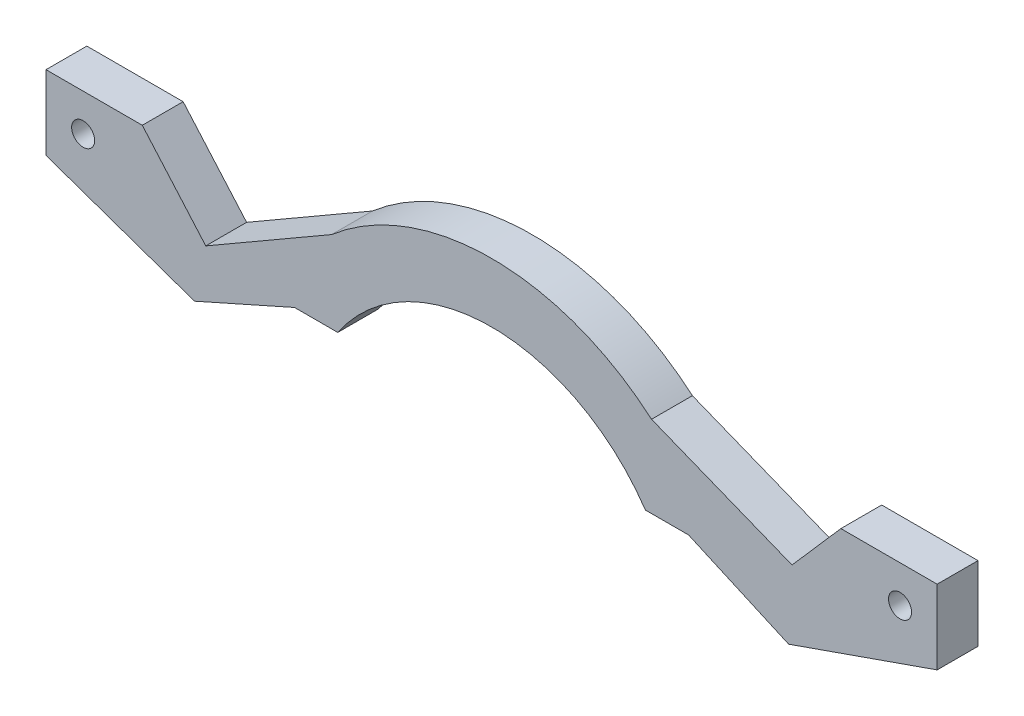
ISO-10303-21;
HEADER;
FILE_DESCRIPTION(('STEP AP214'),'2;1');
FILE_NAME('part.step','',(''),(''),'','','');
FILE_SCHEMA(('AUTOMOTIVE_DESIGN { 1 0 10303 214 1 1 1 1 }'));
ENDSEC;
DATA;
#1=APPLICATION_CONTEXT('core data for automotive mechanical design processes');
#2=APPLICATION_PROTOCOL_DEFINITION('international standard','automotive_design',2000,#1);
#3=PRODUCT_CONTEXT('',#1,'mechanical');
#4=PRODUCT('Part','Part','',(#3));
#5=PRODUCT_RELATED_PRODUCT_CATEGORY('part','',(#4));
#6=PRODUCT_DEFINITION_FORMATION('','',#4);
#7=PRODUCT_DEFINITION_CONTEXT('part definition',#1,'design');
#8=PRODUCT_DEFINITION('design','',#6,#7);
#9=PRODUCT_DEFINITION_SHAPE('','',#8);
#10=(LENGTH_UNIT() NAMED_UNIT(*) SI_UNIT(.MILLI.,.METRE.));
#11=(NAMED_UNIT(*) PLANE_ANGLE_UNIT() SI_UNIT($,.RADIAN.));
#12=(NAMED_UNIT(*) SI_UNIT($,.STERADIAN.) SOLID_ANGLE_UNIT());
#13=UNCERTAINTY_MEASURE_WITH_UNIT(LENGTH_MEASURE(1.E-05),#10,'distance_accuracy_value','');
#14=(GEOMETRIC_REPRESENTATION_CONTEXT(3) GLOBAL_UNCERTAINTY_ASSIGNED_CONTEXT((#13)) GLOBAL_UNIT_ASSIGNED_CONTEXT((#10,
#11,#12)) REPRESENTATION_CONTEXT('',''));
#15=CARTESIAN_POINT('',(0.,0.,0.));
#16=DIRECTION('',(0.,0.,1.));
#17=DIRECTION('',(1.,0.,0.));
#18=AXIS2_PLACEMENT_3D('',#15,#16,#17);
#19=CARTESIAN_POINT('',(-60.0000000000001,-5.00000000000001,5.5));
#20=DIRECTION('',(0.330350424728106,0.943858356366018,0.));
#21=DIRECTION('',(-0.943858356366018,0.330350424728106,0.));
#22=AXIS2_PLACEMENT_3D('',#19,#20,#21);
#23=PLANE('',#22);
#24=DIRECTION('',(0.943858356366017,-0.330350424728106,0.));
#25=VECTOR('',#24,1.);
#26=CARTESIAN_POINT('',(-60.0000000000001,-5.00000000000001,0.));
#27=LINE('',#26,#25);
#28=CARTESIAN_POINT('',(-60.0000000000001,-5.00000000000001,0.));
#29=VERTEX_POINT('',#28);
#30=CARTESIAN_POINT('',(-40.0000000000001,-12.,0.));
#31=VERTEX_POINT('',#30);
#32=EDGE_CURVE('E177',#29,#31,#27,.T.);
#33=ORIENTED_EDGE('',*,*,#32,.T.);
#34=DIRECTION('',(0.,0.,-1.));
#35=VECTOR('',#34,1.);
#36=CARTESIAN_POINT('',(-40.0000000000001,-12.,5.5));
#37=LINE('',#36,#35);
#38=CARTESIAN_POINT('',(-40.0000000000001,-12.,5.5));
#39=VERTEX_POINT('',#38);
#40=EDGE_CURVE('E11',#39,#31,#37,.T.);
#41=ORIENTED_EDGE('',*,*,#40,.F.);
#42=DIRECTION('',(0.943858356366017,-0.330350424728106,0.));
#43=VECTOR('',#42,1.);
#44=CARTESIAN_POINT('',(-60.0000000000001,-5.00000000000001,5.5));
#45=LINE('',#44,#43);
#46=CARTESIAN_POINT('',(-60.0000000000001,-5.00000000000001,5.5));
#47=VERTEX_POINT('',#46);
#48=EDGE_CURVE('E208',#47,#39,#45,.T.);
#49=ORIENTED_EDGE('',*,*,#48,.F.);
#50=DIRECTION('',(0.,0.,-1.));
#51=VECTOR('',#50,1.);
#52=CARTESIAN_POINT('',(-60.0000000000001,-5.00000000000001,5.5));
#53=LINE('',#52,#51);
#54=EDGE_CURVE('E173',#47,#29,#53,.T.);
#55=ORIENTED_EDGE('',*,*,#54,.T.);
#56=EDGE_LOOP('',(#33,#41,#49,#55));
#57=FACE_BOUND('',#56,.T.);
#58=ADVANCED_FACE('F33',(#57),#23,.F.);
#59=CARTESIAN_POINT('',(-40.0000000000001,-12.,5.5));
#60=DIRECTION('',(-0.406968976210372,0.91344198086265,0.));
#61=DIRECTION('',(-0.91344198086265,-0.406968976210372,0.));
#62=AXIS2_PLACEMENT_3D('',#59,#60,#61);
#63=PLANE('',#62);
#64=DIRECTION('',(0.91344198086265,0.406968976210372,0.));
#65=VECTOR('',#64,1.);
#66=CARTESIAN_POINT('',(-40.0000000000001,-12.,0.));
#67=LINE('',#66,#65);
#68=CARTESIAN_POINT('',(-26.5329983228432,-6.00000000000001,0.));
#69=VERTEX_POINT('',#68);
#70=EDGE_CURVE('E180',#31,#69,#67,.T.);
#71=ORIENTED_EDGE('',*,*,#70,.T.);
#72=DIRECTION('',(0.,0.,-1.));
#73=VECTOR('',#72,1.);
#74=CARTESIAN_POINT('',(-26.5329983228432,-6.00000000000001,5.5));
#75=LINE('',#74,#73);
#76=CARTESIAN_POINT('',(-26.5329983228432,-6.00000000000001,5.5));
#77=VERTEX_POINT('',#76);
#78=EDGE_CURVE('E41',#77,#69,#75,.T.);
#79=ORIENTED_EDGE('',*,*,#78,.F.);
#80=DIRECTION('',(0.91344198086265,0.406968976210372,0.));
#81=VECTOR('',#80,1.);
#82=CARTESIAN_POINT('',(-40.0000000000001,-12.,5.5));
#83=LINE('',#82,#81);
#84=EDGE_CURVE('E116',#39,#77,#83,.T.);
#85=ORIENTED_EDGE('',*,*,#84,.F.);
#86=ORIENTED_EDGE('',*,*,#40,.T.);
#87=EDGE_LOOP('',(#71,#79,#85,#86));
#88=FACE_BOUND('',#87,.T.);
#89=ADVANCED_FACE('F307',(#88),#63,.F.);
#90=CARTESIAN_POINT('',(-26.5329983228432,-6.00000000000001,5.5));
#91=DIRECTION('',(0.,1.,0.));
#92=DIRECTION('',(0.,0.,1.));
#93=AXIS2_PLACEMENT_3D('',#90,#91,#92);
#94=PLANE('',#93);
#95=DIRECTION('',(1.,0.,0.));
#96=VECTOR('',#95,1.);
#97=CARTESIAN_POINT('',(-26.5329983228432,-6.00000000000001,0.));
#98=LINE('',#97,#96);
#99=CARTESIAN_POINT('',(-20.712315177208,-6.00000000000002,0.));
#100=VERTEX_POINT('',#99);
#101=EDGE_CURVE('E183',#69,#100,#98,.T.);
#102=ORIENTED_EDGE('',*,*,#101,.T.);
#103=DIRECTION('',(0.,0.,-1.));
#104=VECTOR('',#103,1.);
#105=CARTESIAN_POINT('',(-20.712315177208,-6.00000000000002,5.5));
#106=LINE('',#105,#104);
#107=CARTESIAN_POINT('',(-20.712315177208,-6.00000000000002,5.5));
#108=VERTEX_POINT('',#107);
#109=EDGE_CURVE('E239',#108,#100,#106,.T.);
#110=ORIENTED_EDGE('',*,*,#109,.F.);
#111=DIRECTION('',(1.,0.,0.));
#112=VECTOR('',#111,1.);
#113=CARTESIAN_POINT('',(-26.5329983228432,-6.00000000000001,5.5));
#114=LINE('',#113,#112);
#115=EDGE_CURVE('E247',#77,#108,#114,.T.);
#116=ORIENTED_EDGE('',*,*,#115,.F.);
#117=ORIENTED_EDGE('',*,*,#78,.T.);
#118=EDGE_LOOP('',(#102,#110,#116,#117));
#119=FACE_BOUND('',#118,.T.);
#120=ADVANCED_FACE('F245',(#119),#94,.F.);
#121=CARTESIAN_POINT('',(0.,-20.,5.5));
#122=DIRECTION('',(0.,0.,-1.));
#123=DIRECTION('',(-1.,0.,0.));
#124=AXIS2_PLACEMENT_3D('',#121,#122,#123);
#125=CYLINDRICAL_SURFACE('',#124,25.);
#126=CARTESIAN_POINT('',(0.,-20.,0.));
#127=DIRECTION('',(0.,0.,-1.));
#128=DIRECTION('',(1.,0.,0.));
#129=AXIS2_PLACEMENT_3D('',#126,#127,#128);
#130=CIRCLE('',#129,25.);
#131=CARTESIAN_POINT('',(20.712315177208,-6.00000000000001,0.));
#132=VERTEX_POINT('',#131);
#133=EDGE_CURVE('E185',#100,#132,#130,.T.);
#134=ORIENTED_EDGE('',*,*,#133,.T.);
#135=DIRECTION('',(0.,0.,-1.));
#136=VECTOR('',#135,1.);
#137=CARTESIAN_POINT('',(20.712315177208,-6.00000000000001,5.5));
#138=LINE('',#137,#136);
#139=CARTESIAN_POINT('',(20.712315177208,-6.00000000000001,5.5));
#140=VERTEX_POINT('',#139);
#141=EDGE_CURVE('E236',#140,#132,#138,.T.);
#142=ORIENTED_EDGE('',*,*,#141,.F.);
#143=CARTESIAN_POINT('',(0.,-20.,5.5));
#144=DIRECTION('',(0.,0.,-1.));
#145=DIRECTION('',(1.,0.,0.));
#146=AXIS2_PLACEMENT_3D('',#143,#144,#145);
#147=CIRCLE('',#146,25.);
#148=EDGE_CURVE('E265',#108,#140,#147,.T.);
#149=ORIENTED_EDGE('',*,*,#148,.F.);
#150=ORIENTED_EDGE('',*,*,#109,.T.);
#151=EDGE_LOOP('',(#134,#142,#149,#150));
#152=FACE_BOUND('',#151,.T.);
#153=ADVANCED_FACE('F256',(#152),#125,.F.);
#154=CARTESIAN_POINT('',(20.712315177208,-6.00000000000001,5.5));
#155=DIRECTION('',(0.,1.,0.));
#156=DIRECTION('',(0.,0.,1.));
#157=AXIS2_PLACEMENT_3D('',#154,#155,#156);
#158=PLANE('',#157);
#159=DIRECTION('',(1.,0.,0.));
#160=VECTOR('',#159,1.);
#161=CARTESIAN_POINT('',(20.712315177208,-6.00000000000001,0.));
#162=LINE('',#161,#160);
#163=CARTESIAN_POINT('',(26.5329983228432,-6.00000000000001,0.));
#164=VERTEX_POINT('',#163);
#165=EDGE_CURVE('E187',#132,#164,#162,.T.);
#166=ORIENTED_EDGE('',*,*,#165,.T.);
#167=DIRECTION('',(0.,0.,-1.));
#168=VECTOR('',#167,1.);
#169=CARTESIAN_POINT('',(26.5329983228432,-6.00000000000001,5.5));
#170=LINE('',#169,#168);
#171=CARTESIAN_POINT('',(26.5329983228432,-6.00000000000001,5.5));
#172=VERTEX_POINT('',#171);
#173=EDGE_CURVE('E233',#172,#164,#170,.T.);
#174=ORIENTED_EDGE('',*,*,#173,.F.);
#175=DIRECTION('',(1.,0.,0.));
#176=VECTOR('',#175,1.);
#177=CARTESIAN_POINT('',(20.712315177208,-6.00000000000001,5.5));
#178=LINE('',#177,#176);
#179=EDGE_CURVE('E262',#140,#172,#178,.T.);
#180=ORIENTED_EDGE('',*,*,#179,.F.);
#181=ORIENTED_EDGE('',*,*,#141,.T.);
#182=EDGE_LOOP('',(#166,#174,#180,#181));
#183=FACE_BOUND('',#182,.T.);
#184=ADVANCED_FACE('F260',(#183),#158,.F.);
#185=CARTESIAN_POINT('',(26.5329983228432,-6.00000000000001,5.5));
#186=DIRECTION('',(0.406968976210376,0.913441980862648,0.));
#187=DIRECTION('',(-0.913441980862648,0.406968976210376,0.));
#188=AXIS2_PLACEMENT_3D('',#185,#186,#187);
#189=PLANE('',#188);
#190=DIRECTION('',(0.913441980862648,-0.406968976210376,0.));
#191=VECTOR('',#190,1.);
#192=CARTESIAN_POINT('',(26.5329983228432,-6.00000000000001,0.));
#193=LINE('',#192,#191);
#194=CARTESIAN_POINT('',(39.9999999999999,-12.,0.));
#195=VERTEX_POINT('',#194);
#196=EDGE_CURVE('E189',#164,#195,#193,.T.);
#197=ORIENTED_EDGE('',*,*,#196,.T.);
#198=DIRECTION('',(0.,0.,-1.));
#199=VECTOR('',#198,1.);
#200=CARTESIAN_POINT('',(39.9999999999999,-12.,5.5));
#201=LINE('',#200,#199);
#202=CARTESIAN_POINT('',(39.9999999999999,-12.,5.5));
#203=VERTEX_POINT('',#202);
#204=EDGE_CURVE('E230',#203,#195,#201,.T.);
#205=ORIENTED_EDGE('',*,*,#204,.F.);
#206=DIRECTION('',(0.913441980862648,-0.406968976210376,0.));
#207=VECTOR('',#206,1.);
#208=CARTESIAN_POINT('',(26.5329983228432,-6.00000000000001,5.5));
#209=LINE('',#208,#207);
#210=EDGE_CURVE('E264',#172,#203,#209,.T.);
#211=ORIENTED_EDGE('',*,*,#210,.F.);
#212=ORIENTED_EDGE('',*,*,#173,.T.);
#213=EDGE_LOOP('',(#197,#205,#211,#212));
#214=FACE_BOUND('',#213,.T.);
#215=ADVANCED_FACE('F320',(#214),#189,.F.);
#216=CARTESIAN_POINT('',(59.9999999999999,-4.99999999999998,5.5));
#217=DIRECTION('',(-0.330350424728108,0.943858356366017,0.));
#218=DIRECTION('',(-0.943858356366017,-0.330350424728107,0.));
#219=AXIS2_PLACEMENT_3D('',#216,#217,#218);
#220=PLANE('',#219);
#221=DIRECTION('',(0.943858356366017,0.330350424728107,0.));
#222=VECTOR('',#221,1.);
#223=CARTESIAN_POINT('',(59.9999999999999,-4.99999999999998,0.));
#224=LINE('',#223,#222);
#225=CARTESIAN_POINT('',(59.9999999999999,-4.99999999999998,0.));
#226=VERTEX_POINT('',#225);
#227=EDGE_CURVE('E191',#195,#226,#224,.T.);
#228=ORIENTED_EDGE('',*,*,#227,.T.);
#229=DIRECTION('',(0.,0.,-1.));
#230=VECTOR('',#229,1.);
#231=CARTESIAN_POINT('',(59.9999999999999,-4.99999999999998,5.5));
#232=LINE('',#231,#230);
#233=CARTESIAN_POINT('',(59.9999999999999,-4.99999999999998,5.5));
#234=VERTEX_POINT('',#233);
#235=EDGE_CURVE('E227',#234,#226,#232,.T.);
#236=ORIENTED_EDGE('',*,*,#235,.F.);
#237=DIRECTION('',(0.943858356366017,0.330350424728107,0.));
#238=VECTOR('',#237,1.);
#239=CARTESIAN_POINT('',(59.9999999999999,-4.99999999999998,5.5));
#240=LINE('',#239,#238);
#241=EDGE_CURVE('E267',#203,#234,#240,.T.);
#242=ORIENTED_EDGE('',*,*,#241,.F.);
#243=ORIENTED_EDGE('',*,*,#204,.T.);
#244=EDGE_LOOP('',(#228,#236,#242,#243));
#245=FACE_BOUND('',#244,.T.);
#246=ADVANCED_FACE('F323',(#245),#220,.F.);
#247=CARTESIAN_POINT('',(59.9999999999999,4.99999999999999,5.5));
#248=DIRECTION('',(-1.,0.,0.));
#249=DIRECTION('',(0.,0.,1.));
#250=AXIS2_PLACEMENT_3D('',#247,#248,#249);
#251=PLANE('',#250);
#252=DIRECTION('',(0.,1.,0.));
#253=VECTOR('',#252,1.);
#254=CARTESIAN_POINT('',(59.9999999999999,4.99999999999999,0.));
#255=LINE('',#254,#253);
#256=CARTESIAN_POINT('',(59.9999999999999,4.99999999999999,0.));
#257=VERTEX_POINT('',#256);
#258=EDGE_CURVE('E193',#226,#257,#255,.T.);
#259=ORIENTED_EDGE('',*,*,#258,.T.);
#260=DIRECTION('',(0.,0.,-1.));
#261=VECTOR('',#260,1.);
#262=CARTESIAN_POINT('',(59.9999999999999,4.99999999999999,5.5));
#263=LINE('',#262,#261);
#264=CARTESIAN_POINT('',(59.9999999999999,4.99999999999999,5.5));
#265=VERTEX_POINT('',#264);
#266=EDGE_CURVE('E224',#265,#257,#263,.T.);
#267=ORIENTED_EDGE('',*,*,#266,.F.);
#268=DIRECTION('',(0.,1.,0.));
#269=VECTOR('',#268,1.);
#270=CARTESIAN_POINT('',(59.9999999999999,4.99999999999999,5.5));
#271=LINE('',#270,#269);
#272=EDGE_CURVE('E273',#234,#265,#271,.T.);
#273=ORIENTED_EDGE('',*,*,#272,.F.);
#274=ORIENTED_EDGE('',*,*,#235,.T.);
#275=EDGE_LOOP('',(#259,#267,#273,#274));
#276=FACE_BOUND('',#275,.T.);
#277=ADVANCED_FACE('F327',(#276),#251,.F.);
#278=CARTESIAN_POINT('',(47.033321685723,4.99999999999999,5.5));
#279=DIRECTION('',(0.,-1.,0.));
#280=DIRECTION('',(0.,0.,-1.));
#281=AXIS2_PLACEMENT_3D('',#278,#279,#280);
#282=PLANE('',#281);
#283=DIRECTION('',(-1.,0.,0.));
#284=VECTOR('',#283,1.);
#285=CARTESIAN_POINT('',(47.033321685723,4.99999999999999,0.));
#286=LINE('',#285,#284);
#287=CARTESIAN_POINT('',(47.033321685723,4.99999999999999,0.));
#288=VERTEX_POINT('',#287);
#289=EDGE_CURVE('E195',#257,#288,#286,.T.);
#290=ORIENTED_EDGE('',*,*,#289,.T.);
#291=DIRECTION('',(0.,0.,-1.));
#292=VECTOR('',#291,1.);
#293=CARTESIAN_POINT('',(47.033321685723,4.99999999999999,5.5));
#294=LINE('',#293,#292);
#295=CARTESIAN_POINT('',(47.033321685723,4.99999999999999,5.5));
#296=VERTEX_POINT('',#295);
#297=EDGE_CURVE('E221',#296,#288,#294,.T.);
#298=ORIENTED_EDGE('',*,*,#297,.F.);
#299=DIRECTION('',(-1.,0.,0.));
#300=VECTOR('',#299,1.);
#301=CARTESIAN_POINT('',(47.033321685723,4.99999999999999,5.5));
#302=LINE('',#301,#300);
#303=EDGE_CURVE('E275',#265,#296,#302,.T.);
#304=ORIENTED_EDGE('',*,*,#303,.F.);
#305=ORIENTED_EDGE('',*,*,#266,.T.);
#306=EDGE_LOOP('',(#290,#298,#304,#305));
#307=FACE_BOUND('',#306,.T.);
#308=ADVANCED_FACE('F331',(#307),#282,.F.);
#309=CARTESIAN_POINT('',(40.458326236143,-2.53454941174337,5.5));
#310=DIRECTION('',(0.753454941174336,-0.657499544958,0.));
#311=DIRECTION('',(0.657499544958,0.753454941174336,0.));
#312=AXIS2_PLACEMENT_3D('',#309,#310,#311);
#313=PLANE('',#312);
#314=DIRECTION('',(-0.657499544958,-0.753454941174336,0.));
#315=VECTOR('',#314,1.);
#316=CARTESIAN_POINT('',(40.458326236143,-2.53454941174337,0.));
#317=LINE('',#316,#315);
#318=CARTESIAN_POINT('',(40.458326236143,-2.53454941174337,0.));
#319=VERTEX_POINT('',#318);
#320=EDGE_CURVE('E197',#288,#319,#317,.T.);
#321=ORIENTED_EDGE('',*,*,#320,.T.);
#322=DIRECTION('',(0.,0.,-1.));
#323=VECTOR('',#322,1.);
#324=CARTESIAN_POINT('',(40.458326236143,-2.53454941174337,5.5));
#325=LINE('',#324,#323);
#326=CARTESIAN_POINT('',(40.458326236143,-2.53454941174337,5.5));
#327=VERTEX_POINT('',#326);
#328=EDGE_CURVE('E218',#327,#319,#325,.T.);
#329=ORIENTED_EDGE('',*,*,#328,.F.);
#330=DIRECTION('',(-0.657499544958,-0.753454941174336,0.));
#331=VECTOR('',#330,1.);
#332=CARTESIAN_POINT('',(40.458326236143,-2.53454941174337,5.5));
#333=LINE('',#332,#331);
#334=EDGE_CURVE('E277',#296,#327,#333,.T.);
#335=ORIENTED_EDGE('',*,*,#334,.F.);
#336=ORIENTED_EDGE('',*,*,#297,.T.);
#337=EDGE_LOOP('',(#321,#329,#335,#336));
#338=FACE_BOUND('',#337,.T.);
#339=ADVANCED_FACE('F335',(#338),#313,.F.);
#340=CARTESIAN_POINT('',(21.540659228538,4.99999999999999,5.5));
#341=DIRECTION('',(-0.370013635212555,-0.929026323500465,0.));
#342=DIRECTION('',(0.929026323500465,-0.370013635212555,0.));
#343=AXIS2_PLACEMENT_3D('',#340,#341,#342);
#344=PLANE('',#343);
#345=DIRECTION('',(-0.929026323500465,0.370013635212555,0.));
#346=VECTOR('',#345,1.);
#347=CARTESIAN_POINT('',(21.540659228538,4.99999999999999,0.));
#348=LINE('',#347,#346);
#349=CARTESIAN_POINT('',(21.540659228538,4.99999999999999,0.));
#350=VERTEX_POINT('',#349);
#351=EDGE_CURVE('E199',#319,#350,#348,.T.);
#352=ORIENTED_EDGE('',*,*,#351,.T.);
#353=DIRECTION('',(0.,0.,-1.));
#354=VECTOR('',#353,1.);
#355=CARTESIAN_POINT('',(21.540659228538,4.99999999999999,5.5));
#356=LINE('',#355,#354);
#357=CARTESIAN_POINT('',(21.540659228538,4.99999999999999,5.5));
#358=VERTEX_POINT('',#357);
#359=EDGE_CURVE('E215',#358,#350,#356,.T.);
#360=ORIENTED_EDGE('',*,*,#359,.F.);
#361=DIRECTION('',(-0.929026323500465,0.370013635212555,0.));
#362=VECTOR('',#361,1.);
#363=CARTESIAN_POINT('',(21.540659228538,4.99999999999999,5.5));
#364=LINE('',#363,#362);
#365=EDGE_CURVE('E279',#327,#358,#364,.T.);
#366=ORIENTED_EDGE('',*,*,#365,.F.);
#367=ORIENTED_EDGE('',*,*,#328,.T.);
#368=EDGE_LOOP('',(#352,#360,#366,#367));
#369=FACE_BOUND('',#368,.T.);
#370=ADVANCED_FACE('F339',(#369),#344,.F.);
#371=CARTESIAN_POINT('',(0.,-20.,5.5));
#372=DIRECTION('',(0.,0.,-1.));
#373=DIRECTION('',(-1.,0.,0.));
#374=AXIS2_PLACEMENT_3D('',#371,#372,#373);
#375=CYLINDRICAL_SURFACE('',#374,33.);
#376=CARTESIAN_POINT('',(0.,-20.,0.));
#377=DIRECTION('',(0.,0.,1.));
#378=DIRECTION('',(-1.,0.,0.));
#379=AXIS2_PLACEMENT_3D('',#376,#377,#378);
#380=CIRCLE('',#379,33.);
#381=CARTESIAN_POINT('',(-21.540659228538,4.99999999999999,0.));
#382=VERTEX_POINT('',#381);
#383=EDGE_CURVE('E201',#350,#382,#380,.T.);
#384=ORIENTED_EDGE('',*,*,#383,.T.);
#385=DIRECTION('',(0.,0.,-1.));
#386=VECTOR('',#385,1.);
#387=CARTESIAN_POINT('',(-21.540659228538,4.99999999999999,5.5));
#388=LINE('',#387,#386);
#389=CARTESIAN_POINT('',(-21.540659228538,4.99999999999999,5.5));
#390=VERTEX_POINT('',#389);
#391=EDGE_CURVE('E212',#390,#382,#388,.T.);
#392=ORIENTED_EDGE('',*,*,#391,.F.);
#393=CARTESIAN_POINT('',(0.,-20.,5.5));
#394=DIRECTION('',(0.,0.,1.));
#395=DIRECTION('',(-1.,0.,0.));
#396=AXIS2_PLACEMENT_3D('',#393,#394,#395);
#397=CIRCLE('',#396,33.);
#398=EDGE_CURVE('E281',#358,#390,#397,.T.);
#399=ORIENTED_EDGE('',*,*,#398,.F.);
#400=ORIENTED_EDGE('',*,*,#359,.T.);
#401=EDGE_LOOP('',(#384,#392,#399,#400));
#402=FACE_BOUND('',#401,.T.);
#403=ADVANCED_FACE('F287',(#402),#375,.T.);
#404=CARTESIAN_POINT('',(-38.485827601269,-4.79491423526638,5.5));
#405=DIRECTION('',(0.500445077758163,-0.865768285482684,0.));
#406=DIRECTION('',(0.865768285482684,0.500445077758163,0.));
#407=AXIS2_PLACEMENT_3D('',#404,#405,#406);
#408=PLANE('',#407);
#409=DIRECTION('',(-0.865768285482684,-0.500445077758163,0.));
#410=VECTOR('',#409,1.);
#411=CARTESIAN_POINT('',(-38.485827601269,-4.79491423526638,0.));
#412=LINE('',#411,#410);
#413=CARTESIAN_POINT('',(-38.485827601269,-4.79491423526638,0.));
#414=VERTEX_POINT('',#413);
#415=EDGE_CURVE('E203',#382,#414,#412,.T.);
#416=ORIENTED_EDGE('',*,*,#415,.T.);
#417=DIRECTION('',(0.,0.,-1.));
#418=VECTOR('',#417,1.);
#419=CARTESIAN_POINT('',(-38.485827601269,-4.79491423526638,5.5));
#420=LINE('',#419,#418);
#421=CARTESIAN_POINT('',(-38.485827601269,-4.79491423526638,5.5));
#422=VERTEX_POINT('',#421);
#423=EDGE_CURVE('E168',#422,#414,#420,.T.);
#424=ORIENTED_EDGE('',*,*,#423,.F.);
#425=DIRECTION('',(-0.865768285482684,-0.500445077758163,0.));
#426=VECTOR('',#425,1.);
#427=CARTESIAN_POINT('',(-38.485827601269,-4.79491423526638,5.5));
#428=LINE('',#427,#426);
#429=EDGE_CURVE('E159',#390,#422,#428,.T.);
#430=ORIENTED_EDGE('',*,*,#429,.F.);
#431=ORIENTED_EDGE('',*,*,#391,.T.);
#432=EDGE_LOOP('',(#416,#424,#430,#431));
#433=FACE_BOUND('',#432,.T.);
#434=ADVANCED_FACE('F291',(#433),#408,.F.);
#435=CARTESIAN_POINT('',(-47.0333216857229,4.99999999999999,5.5));
#436=DIRECTION('',(-0.753454941174337,-0.657499544958,0.));
#437=DIRECTION('',(0.657499544958,-0.753454941174337,0.));
#438=AXIS2_PLACEMENT_3D('',#435,#436,#437);
#439=PLANE('',#438);
#440=DIRECTION('',(-0.657499544958,0.753454941174337,0.));
#441=VECTOR('',#440,1.);
#442=CARTESIAN_POINT('',(-47.0333216857229,4.99999999999999,0.));
#443=LINE('',#442,#441);
#444=CARTESIAN_POINT('',(-47.0333216857229,4.99999999999999,0.));
#445=VERTEX_POINT('',#444);
#446=EDGE_CURVE('E167',#414,#445,#443,.T.);
#447=ORIENTED_EDGE('',*,*,#446,.T.);
#448=DIRECTION('',(0.,0.,-1.));
#449=VECTOR('',#448,1.);
#450=CARTESIAN_POINT('',(-47.0333216857229,4.99999999999999,5.5));
#451=LINE('',#450,#449);
#452=CARTESIAN_POINT('',(-47.0333216857229,4.99999999999999,5.5));
#453=VERTEX_POINT('',#452);
#454=EDGE_CURVE('E164',#453,#445,#451,.T.);
#455=ORIENTED_EDGE('',*,*,#454,.F.);
#456=DIRECTION('',(-0.657499544958,0.753454941174337,0.));
#457=VECTOR('',#456,1.);
#458=CARTESIAN_POINT('',(-47.0333216857229,4.99999999999999,5.5));
#459=LINE('',#458,#457);
#460=EDGE_CURVE('E153',#422,#453,#459,.T.);
#461=ORIENTED_EDGE('',*,*,#460,.F.);
#462=ORIENTED_EDGE('',*,*,#423,.T.);
#463=EDGE_LOOP('',(#447,#455,#461,#462));
#464=FACE_BOUND('',#463,.T.);
#465=ADVANCED_FACE('F165',(#464),#439,.F.);
#466=CARTESIAN_POINT('',(-60.0000000000001,4.99999999999999,5.5));
#467=DIRECTION('',(0.,-1.,0.));
#468=DIRECTION('',(0.,0.,-1.));
#469=AXIS2_PLACEMENT_3D('',#466,#467,#468);
#470=PLANE('',#469);
#471=DIRECTION('',(-1.,0.,0.));
#472=VECTOR('',#471,1.);
#473=CARTESIAN_POINT('',(-60.0000000000001,4.99999999999999,0.));
#474=LINE('',#473,#472);
#475=CARTESIAN_POINT('',(-60.0000000000001,4.99999999999999,0.));
#476=VERTEX_POINT('',#475);
#477=EDGE_CURVE('E102',#445,#476,#474,.T.);
#478=ORIENTED_EDGE('',*,*,#477,.T.);
#479=DIRECTION('',(0.,0.,-1.));
#480=VECTOR('',#479,1.);
#481=CARTESIAN_POINT('',(-60.0000000000001,4.99999999999999,5.5));
#482=LINE('',#481,#480);
#483=CARTESIAN_POINT('',(-60.0000000000001,4.99999999999999,5.5));
#484=VERTEX_POINT('',#483);
#485=EDGE_CURVE('E169',#484,#476,#482,.T.);
#486=ORIENTED_EDGE('',*,*,#485,.F.);
#487=DIRECTION('',(-1.,0.,0.));
#488=VECTOR('',#487,1.);
#489=CARTESIAN_POINT('',(-60.0000000000001,4.99999999999999,5.5));
#490=LINE('',#489,#488);
#491=EDGE_CURVE('E157',#453,#484,#490,.T.);
#492=ORIENTED_EDGE('',*,*,#491,.F.);
#493=ORIENTED_EDGE('',*,*,#454,.T.);
#494=EDGE_LOOP('',(#478,#486,#492,#493));
#495=FACE_BOUND('',#494,.T.);
#496=ADVANCED_FACE('F171',(#495),#470,.F.);
#497=CARTESIAN_POINT('',(-60.0000000000001,4.99999999999999,5.5));
#498=DIRECTION('',(1.,0.,0.));
#499=DIRECTION('',(0.,0.,-1.));
#500=AXIS2_PLACEMENT_3D('',#497,#498,#499);
#501=PLANE('',#500);
#502=DIRECTION('',(0.,-1.,0.));
#503=VECTOR('',#502,1.);
#504=CARTESIAN_POINT('',(-60.0000000000001,4.99999999999999,0.));
#505=LINE('',#504,#503);
#506=EDGE_CURVE('E108',#476,#29,#505,.T.);
#507=ORIENTED_EDGE('',*,*,#506,.T.);
#508=ORIENTED_EDGE('',*,*,#54,.F.);
#509=DIRECTION('',(0.,-1.,0.));
#510=VECTOR('',#509,1.);
#511=CARTESIAN_POINT('',(-60.0000000000001,4.99999999999999,5.5));
#512=LINE('',#511,#510);
#513=EDGE_CURVE('E49',#484,#47,#512,.T.);
#514=ORIENTED_EDGE('',*,*,#513,.F.);
#515=ORIENTED_EDGE('',*,*,#485,.T.);
#516=EDGE_LOOP('',(#507,#508,#514,#515));
#517=FACE_BOUND('',#516,.T.);
#518=ADVANCED_FACE('F295',(#517),#501,.F.);
#519=CARTESIAN_POINT('',(0.,-20.,5.5));
#520=DIRECTION('',(0.,0.,1.));
#521=DIRECTION('',(1.,0.,0.));
#522=AXIS2_PLACEMENT_3D('',#519,#520,#521);
#523=PLANE('',#522);
#524=CARTESIAN_POINT('',(-55.,0.,5.5));
#525=DIRECTION('',(0.,0.,1.));
#526=DIRECTION('',(1.,0.,0.));
#527=AXIS2_PLACEMENT_3D('',#524,#525,#526);
#528=CIRCLE('',#527,1.55);
#529=CARTESIAN_POINT('',(-53.45,0.,5.5));
#530=VERTEX_POINT('',#529);
#531=EDGE_CURVE('E404',#530,#530,#528,.T.);
#532=ORIENTED_EDGE('',*,*,#531,.F.);
#533=EDGE_LOOP('',(#532));
#534=FACE_BOUND('',#533,.T.);
#535=CARTESIAN_POINT('',(55.,0.,5.5));
#536=DIRECTION('',(0.,0.,1.));
#537=DIRECTION('',(1.,0.,0.));
#538=AXIS2_PLACEMENT_3D('',#535,#536,#537);
#539=CIRCLE('',#538,1.55);
#540=CARTESIAN_POINT('',(56.55,0.,5.5));
#541=VERTEX_POINT('',#540);
#542=EDGE_CURVE('E409',#541,#541,#539,.T.);
#543=ORIENTED_EDGE('',*,*,#542,.F.);
#544=EDGE_LOOP('',(#543));
#545=FACE_BOUND('',#544,.T.);
#546=ORIENTED_EDGE('',*,*,#48,.T.);
#547=ORIENTED_EDGE('',*,*,#84,.T.);
#548=ORIENTED_EDGE('',*,*,#115,.T.);
#549=ORIENTED_EDGE('',*,*,#148,.T.);
#550=ORIENTED_EDGE('',*,*,#179,.T.);
#551=ORIENTED_EDGE('',*,*,#210,.T.);
#552=ORIENTED_EDGE('',*,*,#241,.T.);
#553=ORIENTED_EDGE('',*,*,#272,.T.);
#554=ORIENTED_EDGE('',*,*,#303,.T.);
#555=ORIENTED_EDGE('',*,*,#334,.T.);
#556=ORIENTED_EDGE('',*,*,#365,.T.);
#557=ORIENTED_EDGE('',*,*,#398,.T.);
#558=ORIENTED_EDGE('',*,*,#429,.T.);
#559=ORIENTED_EDGE('',*,*,#460,.T.);
#560=ORIENTED_EDGE('',*,*,#491,.T.);
#561=ORIENTED_EDGE('',*,*,#513,.T.);
#562=EDGE_LOOP('',(#546,#547,#548,#549,#550,#551,#552,#553,#554,#555,#556,#557,#558,#559,#560,#561));
#563=FACE_BOUND('',#562,.T.);
#564=ADVANCED_FACE('F155',(#534,#545,#563),#523,.T.);
#565=CARTESIAN_POINT('',(0.,-20.,0.));
#566=DIRECTION('',(0.,0.,1.));
#567=DIRECTION('',(1.,0.,0.));
#568=AXIS2_PLACEMENT_3D('',#565,#566,#567);
#569=PLANE('',#568);
#570=CARTESIAN_POINT('',(-55.,0.,0.));
#571=DIRECTION('',(0.,0.,1.));
#572=DIRECTION('',(1.,0.,0.));
#573=AXIS2_PLACEMENT_3D('',#570,#571,#572);
#574=CIRCLE('',#573,1.55);
#575=CARTESIAN_POINT('',(-53.45,0.,0.));
#576=VERTEX_POINT('',#575);
#577=EDGE_CURVE('E181',#576,#576,#574,.T.);
#578=ORIENTED_EDGE('',*,*,#577,.T.);
#579=EDGE_LOOP('',(#578));
#580=FACE_BOUND('',#579,.T.);
#581=CARTESIAN_POINT('',(55.,0.,0.));
#582=DIRECTION('',(0.,0.,1.));
#583=DIRECTION('',(1.,0.,0.));
#584=AXIS2_PLACEMENT_3D('',#581,#582,#583);
#585=CIRCLE('',#584,1.55);
#586=CARTESIAN_POINT('',(56.55,0.,0.));
#587=VERTEX_POINT('',#586);
#588=EDGE_CURVE('E405',#587,#587,#585,.T.);
#589=ORIENTED_EDGE('',*,*,#588,.T.);
#590=EDGE_LOOP('',(#589));
#591=FACE_BOUND('',#590,.T.);
#592=ORIENTED_EDGE('',*,*,#32,.F.);
#593=ORIENTED_EDGE('',*,*,#506,.F.);
#594=ORIENTED_EDGE('',*,*,#477,.F.);
#595=ORIENTED_EDGE('',*,*,#446,.F.);
#596=ORIENTED_EDGE('',*,*,#415,.F.);
#597=ORIENTED_EDGE('',*,*,#383,.F.);
#598=ORIENTED_EDGE('',*,*,#351,.F.);
#599=ORIENTED_EDGE('',*,*,#320,.F.);
#600=ORIENTED_EDGE('',*,*,#289,.F.);
#601=ORIENTED_EDGE('',*,*,#258,.F.);
#602=ORIENTED_EDGE('',*,*,#227,.F.);
#603=ORIENTED_EDGE('',*,*,#196,.F.);
#604=ORIENTED_EDGE('',*,*,#165,.F.);
#605=ORIENTED_EDGE('',*,*,#133,.F.);
#606=ORIENTED_EDGE('',*,*,#101,.F.);
#607=ORIENTED_EDGE('',*,*,#70,.F.);
#608=EDGE_LOOP('',(#592,#593,#594,#595,#596,#597,#598,#599,#600,#601,#602,#603,#604,#605,#606,#607));
#609=FACE_BOUND('',#608,.T.);
#610=ADVANCED_FACE('F251',(#580,#591,#609),#569,.F.);
#611=CARTESIAN_POINT('',(55.,0.,0.));
#612=DIRECTION('',(0.,0.,1.));
#613=DIRECTION('',(1.,0.,0.));
#614=AXIS2_PLACEMENT_3D('',#611,#612,#613);
#615=CYLINDRICAL_SURFACE('',#614,1.55);
#616=ORIENTED_EDGE('',*,*,#588,.F.);
#617=EDGE_LOOP('',(#616));
#618=FACE_BOUND('',#617,.T.);
#619=ORIENTED_EDGE('',*,*,#542,.T.);
#620=EDGE_LOOP('',(#619));
#621=FACE_BOUND('',#620,.T.);
#622=ADVANCED_FACE('F376',(#618,#621),#615,.F.);
#623=CARTESIAN_POINT('',(-55.,0.,0.));
#624=DIRECTION('',(0.,0.,1.));
#625=DIRECTION('',(1.,0.,0.));
#626=AXIS2_PLACEMENT_3D('',#623,#624,#625);
#627=CYLINDRICAL_SURFACE('',#626,1.55);
#628=ORIENTED_EDGE('',*,*,#577,.F.);
#629=EDGE_LOOP('',(#628));
#630=FACE_BOUND('',#629,.T.);
#631=ORIENTED_EDGE('',*,*,#531,.T.);
#632=EDGE_LOOP('',(#631));
#633=FACE_BOUND('',#632,.T.);
#634=ADVANCED_FACE('F385',(#630,#633),#627,.F.);
#635=CLOSED_SHELL('',(#58,#89,#120,#153,#184,#215,#246,#277,#308,#339,#370,#403,#434,#465,#496,
#518,#564,#610,#622,#634));
#636=MANIFOLD_SOLID_BREP('B2',#635);
#637=ADVANCED_BREP_SHAPE_REPRESENTATION('',(#18,#636),#14);
#638=SHAPE_DEFINITION_REPRESENTATION(#9,#637);
ENDSEC;
END-ISO-10303-21;
